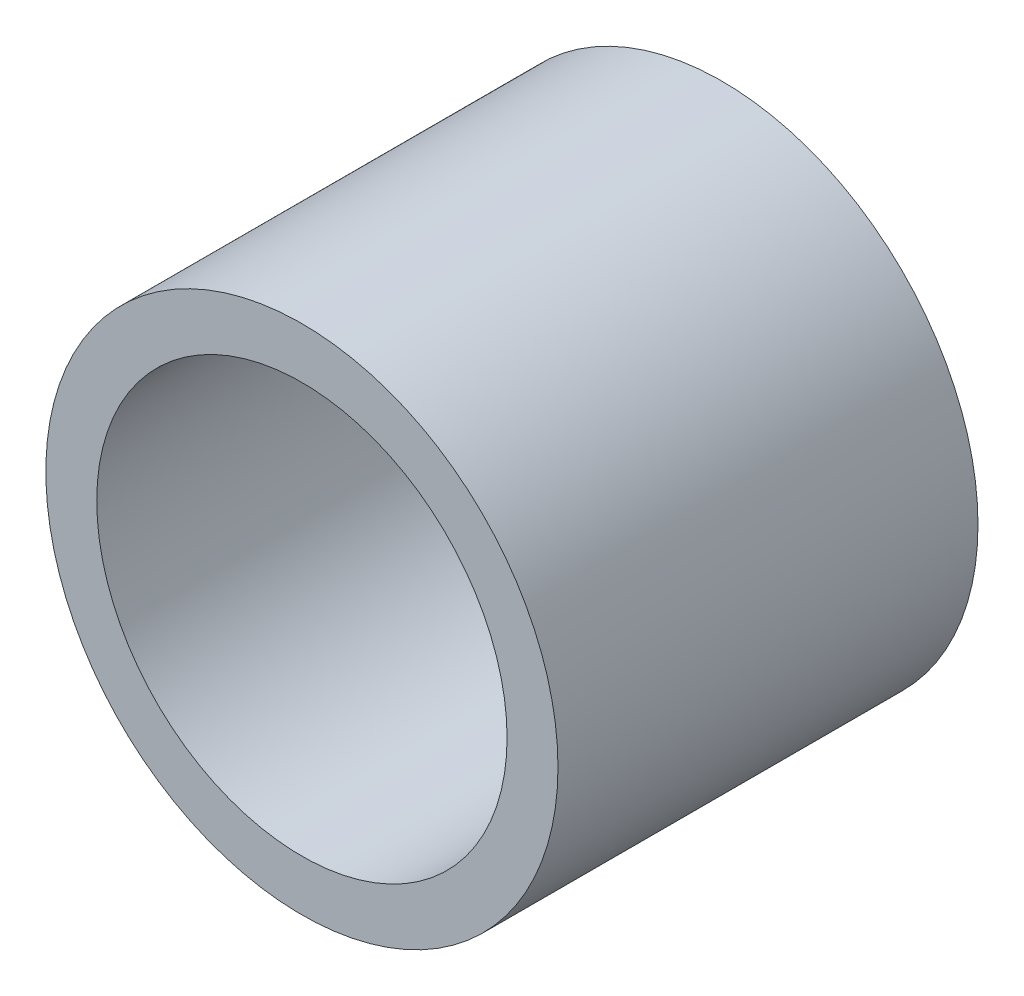
ISO-10303-21;
HEADER;
FILE_DESCRIPTION(('STEP AP214'),'2;1');
FILE_NAME('part.step','',(''),(''),'','','');
FILE_SCHEMA(('AUTOMOTIVE_DESIGN { 1 0 10303 214 1 1 1 1 }'));
ENDSEC;
DATA;
#1=APPLICATION_CONTEXT('core data for automotive mechanical design processes');
#2=APPLICATION_PROTOCOL_DEFINITION('international standard','automotive_design',2000,#1);
#3=PRODUCT_CONTEXT('',#1,'mechanical');
#4=PRODUCT('Part','Part','',(#3));
#5=PRODUCT_RELATED_PRODUCT_CATEGORY('part','',(#4));
#6=PRODUCT_DEFINITION_FORMATION('','',#4);
#7=PRODUCT_DEFINITION_CONTEXT('part definition',#1,'design');
#8=PRODUCT_DEFINITION('design','',#6,#7);
#9=PRODUCT_DEFINITION_SHAPE('','',#8);
#10=(LENGTH_UNIT() NAMED_UNIT(*) SI_UNIT(.MILLI.,.METRE.));
#11=(NAMED_UNIT(*) PLANE_ANGLE_UNIT() SI_UNIT($,.RADIAN.));
#12=(NAMED_UNIT(*) SI_UNIT($,.STERADIAN.) SOLID_ANGLE_UNIT());
#13=UNCERTAINTY_MEASURE_WITH_UNIT(LENGTH_MEASURE(1.E-05),#10,'distance_accuracy_value','');
#14=(GEOMETRIC_REPRESENTATION_CONTEXT(3) GLOBAL_UNCERTAINTY_ASSIGNED_CONTEXT((#13)) GLOBAL_UNIT_ASSIGNED_CONTEXT((#10,
#11,#12)) REPRESENTATION_CONTEXT('',''));
#15=CARTESIAN_POINT('',(0.,0.,0.));
#16=DIRECTION('',(0.,0.,1.));
#17=DIRECTION('',(1.,0.,0.));
#18=AXIS2_PLACEMENT_3D('',#15,#16,#17);
#19=CARTESIAN_POINT('',(0.,0.,8.25));
#20=DIRECTION('',(0.,0.,1.));
#21=DIRECTION('',(1.,0.,0.));
#22=AXIS2_PLACEMENT_3D('',#19,#20,#21);
#23=PLANE('',#22);
#24=CARTESIAN_POINT('',(0.,0.,8.25));
#25=DIRECTION('',(0.,0.,1.));
#26=DIRECTION('',(1.,0.,0.));
#27=AXIS2_PLACEMENT_3D('',#24,#25,#26);
#28=CIRCLE('',#27,5.03);
#29=CARTESIAN_POINT('',(5.03,0.,8.25));
#30=VERTEX_POINT('',#29);
#31=EDGE_CURVE('E11',#30,#30,#28,.T.);
#32=ORIENTED_EDGE('',*,*,#31,.T.);
#33=EDGE_LOOP('',(#32));
#34=FACE_BOUND('',#33,.T.);
#35=CARTESIAN_POINT('',(0.,0.,8.25));
#36=DIRECTION('',(0.,0.,1.));
#37=DIRECTION('',(1.,0.,0.));
#38=AXIS2_PLACEMENT_3D('',#35,#36,#37);
#39=CIRCLE('',#38,4.03);
#40=CARTESIAN_POINT('',(4.03,0.,8.25));
#41=VERTEX_POINT('',#40);
#42=EDGE_CURVE('E63',#41,#41,#39,.T.);
#43=ORIENTED_EDGE('',*,*,#42,.F.);
#44=EDGE_LOOP('',(#43));
#45=FACE_BOUND('',#44,.T.);
#46=ADVANCED_FACE('F51',(#34,#45),#23,.T.);
#47=CARTESIAN_POINT('',(0.,0.,0.));
#48=DIRECTION('',(0.,0.,1.));
#49=DIRECTION('',(1.,0.,0.));
#50=AXIS2_PLACEMENT_3D('',#47,#48,#49);
#51=PLANE('',#50);
#52=CARTESIAN_POINT('',(0.,0.,0.));
#53=DIRECTION('',(0.,0.,1.));
#54=DIRECTION('',(1.,0.,0.));
#55=AXIS2_PLACEMENT_3D('',#52,#53,#54);
#56=CIRCLE('',#55,5.03);
#57=CARTESIAN_POINT('',(5.03,0.,0.));
#58=VERTEX_POINT('',#57);
#59=EDGE_CURVE('E54',#58,#58,#56,.T.);
#60=ORIENTED_EDGE('',*,*,#59,.F.);
#61=EDGE_LOOP('',(#60));
#62=FACE_BOUND('',#61,.T.);
#63=CARTESIAN_POINT('',(0.,0.,0.));
#64=DIRECTION('',(0.,0.,1.));
#65=DIRECTION('',(1.,0.,0.));
#66=AXIS2_PLACEMENT_3D('',#63,#64,#65);
#67=CIRCLE('',#66,4.03);
#68=CARTESIAN_POINT('',(4.03,0.,0.));
#69=VERTEX_POINT('',#68);
#70=EDGE_CURVE('E66',#69,#69,#67,.T.);
#71=ORIENTED_EDGE('',*,*,#70,.T.);
#72=EDGE_LOOP('',(#71));
#73=FACE_BOUND('',#72,.T.);
#74=ADVANCED_FACE('F80',(#62,#73),#51,.F.);
#75=CARTESIAN_POINT('',(0.,0.,8.25));
#76=DIRECTION('',(0.,0.,-1.));
#77=DIRECTION('',(-1.,0.,0.));
#78=AXIS2_PLACEMENT_3D('',#75,#76,#77);
#79=CYLINDRICAL_SURFACE('',#78,5.03);
#80=ORIENTED_EDGE('',*,*,#31,.F.);
#81=EDGE_LOOP('',(#80));
#82=FACE_BOUND('',#81,.T.);
#83=ORIENTED_EDGE('',*,*,#59,.T.);
#84=EDGE_LOOP('',(#83));
#85=FACE_BOUND('',#84,.T.);
#86=ADVANCED_FACE('F52',(#82,#85),#79,.T.);
#87=CARTESIAN_POINT('',(0.,0.,8.25));
#88=DIRECTION('',(0.,0.,-1.));
#89=DIRECTION('',(-1.,0.,0.));
#90=AXIS2_PLACEMENT_3D('',#87,#88,#89);
#91=CYLINDRICAL_SURFACE('',#90,4.03);
#92=ORIENTED_EDGE('',*,*,#42,.T.);
#93=EDGE_LOOP('',(#92));
#94=FACE_BOUND('',#93,.T.);
#95=ORIENTED_EDGE('',*,*,#70,.F.);
#96=EDGE_LOOP('',(#95));
#97=FACE_BOUND('',#96,.T.);
#98=ADVANCED_FACE('F74',(#94,#97),#91,.F.);
#99=CLOSED_SHELL('',(#46,#74,#86,#98));
#100=MANIFOLD_SOLID_BREP('B2',#99);
#101=ADVANCED_BREP_SHAPE_REPRESENTATION('',(#18,#100),#14);
#102=SHAPE_DEFINITION_REPRESENTATION(#9,#101);
ENDSEC;
END-ISO-10303-21;
